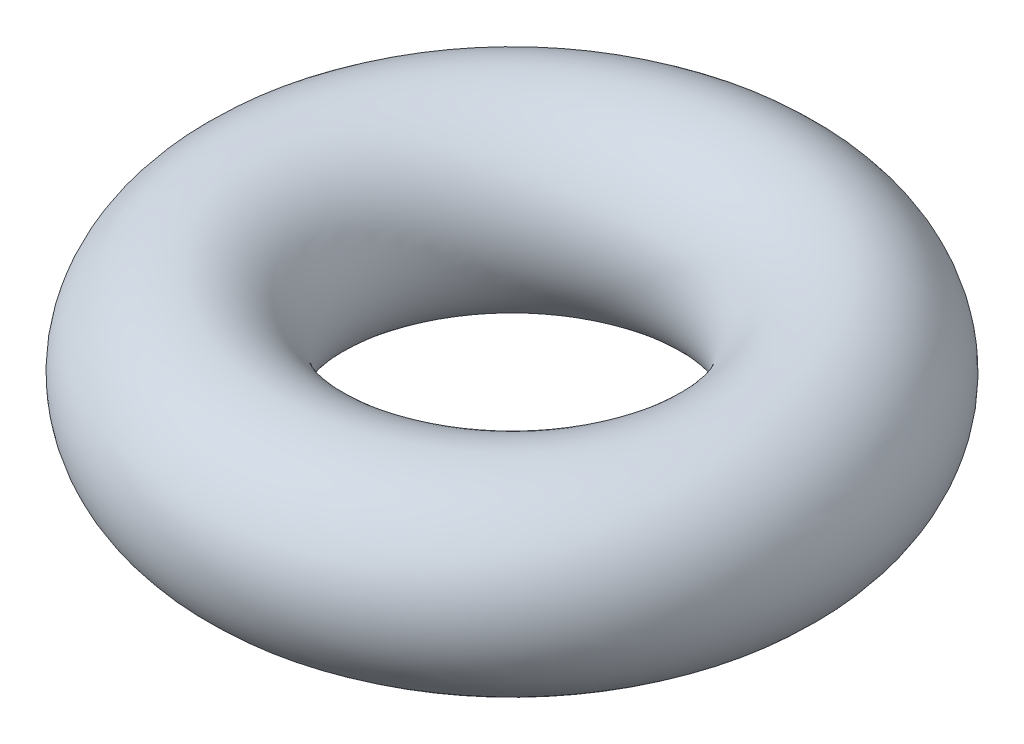
ISO-10303-21;
HEADER;
FILE_DESCRIPTION(('STEP AP214'),'2;1');
FILE_NAME('part.step','',(''),(''),'','','');
FILE_SCHEMA(('AUTOMOTIVE_DESIGN { 1 0 10303 214 1 1 1 1 }'));
ENDSEC;
DATA;
#1=APPLICATION_CONTEXT('core data for automotive mechanical design processes');
#2=APPLICATION_PROTOCOL_DEFINITION('international standard','automotive_design',2000,#1);
#3=PRODUCT_CONTEXT('',#1,'mechanical');
#4=PRODUCT('Part','Part','',(#3));
#5=PRODUCT_RELATED_PRODUCT_CATEGORY('part','',(#4));
#6=PRODUCT_DEFINITION_FORMATION('','',#4);
#7=PRODUCT_DEFINITION_CONTEXT('part definition',#1,'design');
#8=PRODUCT_DEFINITION('design','',#6,#7);
#9=PRODUCT_DEFINITION_SHAPE('','',#8);
#10=(LENGTH_UNIT() NAMED_UNIT(*) SI_UNIT(.MILLI.,.METRE.));
#11=(NAMED_UNIT(*) PLANE_ANGLE_UNIT() SI_UNIT($,.RADIAN.));
#12=(NAMED_UNIT(*) SI_UNIT($,.STERADIAN.) SOLID_ANGLE_UNIT());
#13=UNCERTAINTY_MEASURE_WITH_UNIT(LENGTH_MEASURE(1.E-05),#10,'distance_accuracy_value','');
#14=(GEOMETRIC_REPRESENTATION_CONTEXT(3) GLOBAL_UNCERTAINTY_ASSIGNED_CONTEXT((#13)) GLOBAL_UNIT_ASSIGNED_CONTEXT((#10,
#11,#12)) REPRESENTATION_CONTEXT('',''));
#15=CARTESIAN_POINT('',(0.,0.,0.));
#16=DIRECTION('',(0.,0.,1.));
#17=DIRECTION('',(1.,0.,0.));
#18=AXIS2_PLACEMENT_3D('',#15,#16,#17);
#19=CARTESIAN_POINT('',(-63.5,0.,0.));
#20=DIRECTION('',(0.,1.,0.));
#21=DIRECTION('',(-1.,0.,0.));
#22=AXIS2_PLACEMENT_3D('',#19,#20,#21);
#23=TOROIDAL_SURFACE('',#22,63.5,25.4);
#24=CARTESIAN_POINT('',(-152.4,0.,0.));
#25=VERTEX_POINT('',#24);
#26=VERTEX_LOOP('',#25);
#27=FACE_BOUND('',#26,.T.);
#28=ADVANCED_FACE('F39',(#27),#23,.T.);
#29=CLOSED_SHELL('',(#28));
#30=MANIFOLD_SOLID_BREP('B2',#29);
#31=ADVANCED_BREP_SHAPE_REPRESENTATION('',(#18,#30),#14);
#32=SHAPE_DEFINITION_REPRESENTATION(#9,#31);
ENDSEC;
END-ISO-10303-21;
